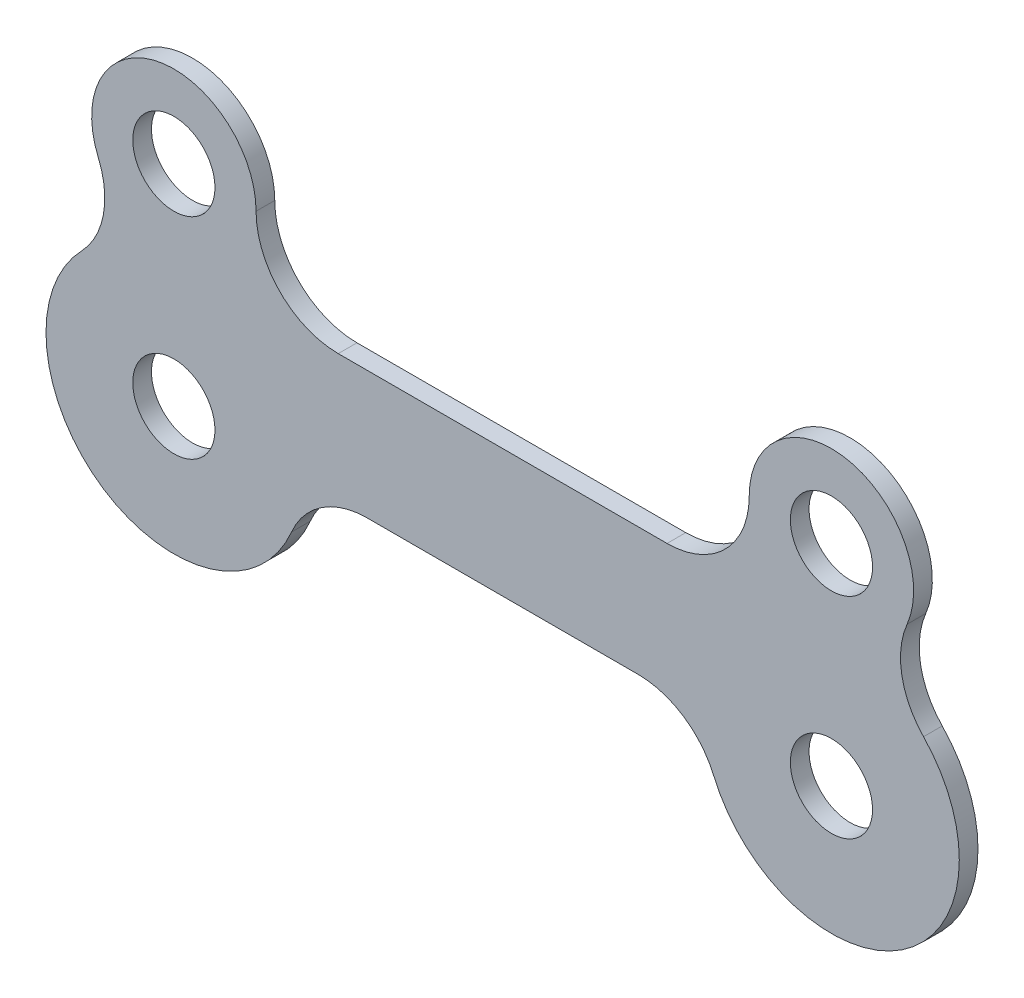
ISO-10303-21;
HEADER;
FILE_DESCRIPTION(('STEP AP214'),'2;1');
FILE_NAME('part.step','',(''),(''),'','','');
FILE_SCHEMA(('AUTOMOTIVE_DESIGN { 1 0 10303 214 1 1 1 1 }'));
ENDSEC;
DATA;
#1=APPLICATION_CONTEXT('core data for automotive mechanical design processes');
#2=APPLICATION_PROTOCOL_DEFINITION('international standard','automotive_design',2000,#1);
#3=PRODUCT_CONTEXT('',#1,'mechanical');
#4=PRODUCT('Part','Part','',(#3));
#5=PRODUCT_RELATED_PRODUCT_CATEGORY('part','',(#4));
#6=PRODUCT_DEFINITION_FORMATION('','',#4);
#7=PRODUCT_DEFINITION_CONTEXT('part definition',#1,'design');
#8=PRODUCT_DEFINITION('design','',#6,#7);
#9=PRODUCT_DEFINITION_SHAPE('','',#8);
#10=(LENGTH_UNIT() NAMED_UNIT(*) SI_UNIT(.MILLI.,.METRE.));
#11=(NAMED_UNIT(*) PLANE_ANGLE_UNIT() SI_UNIT($,.RADIAN.));
#12=(NAMED_UNIT(*) SI_UNIT($,.STERADIAN.) SOLID_ANGLE_UNIT());
#13=UNCERTAINTY_MEASURE_WITH_UNIT(LENGTH_MEASURE(1.E-05),#10,'distance_accuracy_value','');
#14=(GEOMETRIC_REPRESENTATION_CONTEXT(3) GLOBAL_UNCERTAINTY_ASSIGNED_CONTEXT((#13)) GLOBAL_UNIT_ASSIGNED_CONTEXT((#10,
#11,#12)) REPRESENTATION_CONTEXT('',''));
#15=CARTESIAN_POINT('',(0.,0.,0.));
#16=DIRECTION('',(0.,0.,1.));
#17=DIRECTION('',(1.,0.,0.));
#18=AXIS2_PLACEMENT_3D('',#15,#16,#17);
#19=CARTESIAN_POINT('',(35.149116844667,6.33274456521739,0.8128));
#20=DIRECTION('',(0.,0.,-1.));
#21=DIRECTION('',(-1.,0.,0.));
#22=AXIS2_PLACEMENT_3D('',#19,#20,#21);
#23=CYLINDRICAL_SURFACE('',#22,3.571875);
#24=CARTESIAN_POINT('',(35.149116844667,6.33274456521739,0.));
#25=DIRECTION('',(0.,0.,1.));
#26=DIRECTION('',(1.,0.,0.));
#27=AXIS2_PLACEMENT_3D('',#24,#25,#26);
#28=CIRCLE('',#27,3.571875);
#29=CARTESIAN_POINT('',(31.8620584223335,7.7304347826087,0.));
#30=VERTEX_POINT('',#29);
#31=CARTESIAN_POINT('',(32.5766363402321,3.8547140831758,0.));
#32=VERTEX_POINT('',#31);
#33=EDGE_CURVE('E180',#30,#32,#28,.T.);
#34=ORIENTED_EDGE('',*,*,#33,.F.);
#35=DIRECTION('',(0.,0.,-1.));
#36=VECTOR('',#35,1.);
#37=CARTESIAN_POINT('',(31.8620584223335,7.7304347826087,0.8128));
#38=LINE('',#37,#36);
#39=CARTESIAN_POINT('',(31.8620584223335,7.7304347826087,0.8128));
#40=VERTEX_POINT('',#39);
#41=EDGE_CURVE('E11',#40,#30,#38,.T.);
#42=ORIENTED_EDGE('',*,*,#41,.F.);
#43=CARTESIAN_POINT('',(35.149116844667,6.33274456521739,0.8128));
#44=DIRECTION('',(0.,0.,1.));
#45=DIRECTION('',(1.,0.,0.));
#46=AXIS2_PLACEMENT_3D('',#43,#44,#45);
#47=CIRCLE('',#46,3.571875);
#48=CARTESIAN_POINT('',(32.5766363402321,3.8547140831758,0.8128));
#49=VERTEX_POINT('',#48);
#50=EDGE_CURVE('E240',#40,#49,#47,.T.);
#51=ORIENTED_EDGE('',*,*,#50,.T.);
#52=DIRECTION('',(0.,0.,-1.));
#53=VECTOR('',#52,1.);
#54=CARTESIAN_POINT('',(32.5766363402321,3.8547140831758,0.8128));
#55=LINE('',#54,#53);
#56=EDGE_CURVE('E104',#49,#32,#55,.T.);
#57=ORIENTED_EDGE('',*,*,#56,.T.);
#58=EDGE_LOOP('',(#34,#42,#51,#57));
#59=FACE_BOUND('',#58,.T.);
#60=ADVANCED_FACE('F41',(#59),#23,.F.);
#61=CARTESIAN_POINT('',(28.575,9.128125,0.8128));
#62=DIRECTION('',(0.,0.,-1.));
#63=DIRECTION('',(-1.,0.,0.));
#64=AXIS2_PLACEMENT_3D('',#61,#62,#63);
#65=CYLINDRICAL_SURFACE('',#64,3.57187499999999);
#66=CARTESIAN_POINT('',(28.575,9.128125,0.));
#67=DIRECTION('',(0.,0.,1.));
#68=DIRECTION('',(1.,0.,0.));
#69=AXIS2_PLACEMENT_3D('',#66,#67,#68);
#70=CIRCLE('',#69,3.57187499999999);
#71=CARTESIAN_POINT('',(25.003125,9.128125,0.));
#72=VERTEX_POINT('',#71);
#73=EDGE_CURVE('E184',#30,#72,#70,.T.);
#74=ORIENTED_EDGE('',*,*,#73,.T.);
#75=DIRECTION('',(0.,0.,-1.));
#76=VECTOR('',#75,1.);
#77=CARTESIAN_POINT('',(25.003125,9.128125,0.8128));
#78=LINE('',#77,#76);
#79=CARTESIAN_POINT('',(25.003125,9.128125,0.8128));
#80=VERTEX_POINT('',#79);
#81=EDGE_CURVE('E50',#80,#72,#78,.T.);
#82=ORIENTED_EDGE('',*,*,#81,.F.);
#83=CARTESIAN_POINT('',(28.575,9.128125,0.8128));
#84=DIRECTION('',(0.,0.,1.));
#85=DIRECTION('',(1.,0.,0.));
#86=AXIS2_PLACEMENT_3D('',#83,#84,#85);
#87=CIRCLE('',#86,3.57187499999999);
#88=EDGE_CURVE('E288',#40,#80,#87,.T.);
#89=ORIENTED_EDGE('',*,*,#88,.F.);
#90=ORIENTED_EDGE('',*,*,#41,.T.);
#91=EDGE_LOOP('',(#74,#82,#89,#90));
#92=FACE_BOUND('',#91,.T.);
#93=ADVANCED_FACE('F274',(#92),#65,.T.);
#94=CARTESIAN_POINT('',(21.43125,9.128125,0.8128));
#95=DIRECTION('',(0.,0.,-1.));
#96=DIRECTION('',(-1.,0.,0.));
#97=AXIS2_PLACEMENT_3D('',#94,#95,#96);
#98=CYLINDRICAL_SURFACE('',#97,3.571875);
#99=CARTESIAN_POINT('',(21.43125,9.128125,0.));
#100=DIRECTION('',(0.,0.,1.));
#101=DIRECTION('',(1.,0.,0.));
#102=AXIS2_PLACEMENT_3D('',#99,#100,#101);
#103=CIRCLE('',#102,3.571875);
#104=CARTESIAN_POINT('',(21.43125,5.55625,0.));
#105=VERTEX_POINT('',#104);
#106=EDGE_CURVE('E188',#105,#72,#103,.T.);
#107=ORIENTED_EDGE('',*,*,#106,.F.);
#108=DIRECTION('',(0.,0.,-1.));
#109=VECTOR('',#108,1.);
#110=CARTESIAN_POINT('',(21.43125,5.55625,0.8128));
#111=LINE('',#110,#109);
#112=CARTESIAN_POINT('',(21.43125,5.55625,0.8128));
#113=VERTEX_POINT('',#112);
#114=EDGE_CURVE('E262',#113,#105,#111,.T.);
#115=ORIENTED_EDGE('',*,*,#114,.F.);
#116=CARTESIAN_POINT('',(21.43125,9.128125,0.8128));
#117=DIRECTION('',(0.,0.,1.));
#118=DIRECTION('',(1.,0.,0.));
#119=AXIS2_PLACEMENT_3D('',#116,#117,#118);
#120=CIRCLE('',#119,3.571875);
#121=EDGE_CURVE('E271',#113,#80,#120,.T.);
#122=ORIENTED_EDGE('',*,*,#121,.T.);
#123=ORIENTED_EDGE('',*,*,#81,.T.);
#124=EDGE_LOOP('',(#107,#115,#122,#123));
#125=FACE_BOUND('',#124,.T.);
#126=ADVANCED_FACE('F269',(#125),#98,.F.);
#127=CARTESIAN_POINT('',(0.,5.55625,0.8128));
#128=DIRECTION('',(0.,1.,0.));
#129=DIRECTION('',(0.,0.,1.));
#130=AXIS2_PLACEMENT_3D('',#127,#128,#129);
#131=PLANE('',#130);
#132=DIRECTION('',(1.,0.,0.));
#133=VECTOR('',#132,1.);
#134=CARTESIAN_POINT('',(0.,5.55625,0.));
#135=LINE('',#134,#133);
#136=CARTESIAN_POINT('',(7.14375,5.55625,0.));
#137=VERTEX_POINT('',#136);
#138=EDGE_CURVE('E192',#137,#105,#135,.T.);
#139=ORIENTED_EDGE('',*,*,#138,.F.);
#140=DIRECTION('',(0.,0.,-1.));
#141=VECTOR('',#140,1.);
#142=CARTESIAN_POINT('',(7.14375,5.55625,0.8128));
#143=LINE('',#142,#141);
#144=CARTESIAN_POINT('',(7.14375,5.55625,0.8128));
#145=VERTEX_POINT('',#144);
#146=EDGE_CURVE('E259',#145,#137,#143,.T.);
#147=ORIENTED_EDGE('',*,*,#146,.F.);
#148=DIRECTION('',(1.,0.,0.));
#149=VECTOR('',#148,1.);
#150=CARTESIAN_POINT('',(0.,5.55625,0.8128));
#151=LINE('',#150,#149);
#152=EDGE_CURVE('E285',#145,#113,#151,.T.);
#153=ORIENTED_EDGE('',*,*,#152,.T.);
#154=ORIENTED_EDGE('',*,*,#114,.T.);
#155=EDGE_LOOP('',(#139,#147,#153,#154));
#156=FACE_BOUND('',#155,.T.);
#157=ADVANCED_FACE('F282',(#156),#131,.T.);
#158=CARTESIAN_POINT('',(7.14375,9.128125,0.8128));
#159=DIRECTION('',(0.,0.,-1.));
#160=DIRECTION('',(-1.,0.,0.));
#161=AXIS2_PLACEMENT_3D('',#158,#159,#160);
#162=CYLINDRICAL_SURFACE('',#161,3.571875);
#163=CARTESIAN_POINT('',(7.14375,9.128125,0.));
#164=DIRECTION('',(0.,0.,1.));
#165=DIRECTION('',(1.,0.,0.));
#166=AXIS2_PLACEMENT_3D('',#163,#164,#165);
#167=CIRCLE('',#166,3.571875);
#168=CARTESIAN_POINT('',(3.571875,9.128125,0.));
#169=VERTEX_POINT('',#168);
#170=EDGE_CURVE('E196',#169,#137,#167,.T.);
#171=ORIENTED_EDGE('',*,*,#170,.F.);
#172=DIRECTION('',(0.,0.,-1.));
#173=VECTOR('',#172,1.);
#174=CARTESIAN_POINT('',(3.571875,9.128125,0.8128));
#175=LINE('',#174,#173);
#176=CARTESIAN_POINT('',(3.571875,9.128125,0.8128));
#177=VERTEX_POINT('',#176);
#178=EDGE_CURVE('E256',#177,#169,#175,.T.);
#179=ORIENTED_EDGE('',*,*,#178,.F.);
#180=CARTESIAN_POINT('',(7.14375,9.128125,0.8128));
#181=DIRECTION('',(0.,0.,1.));
#182=DIRECTION('',(1.,0.,0.));
#183=AXIS2_PLACEMENT_3D('',#180,#181,#182);
#184=CIRCLE('',#183,3.571875);
#185=EDGE_CURVE('E293',#177,#145,#184,.T.);
#186=ORIENTED_EDGE('',*,*,#185,.T.);
#187=ORIENTED_EDGE('',*,*,#146,.T.);
#188=EDGE_LOOP('',(#171,#179,#186,#187));
#189=FACE_BOUND('',#188,.T.);
#190=ADVANCED_FACE('F328',(#189),#162,.F.);
#191=CARTESIAN_POINT('',(0.,9.128125,0.8128));
#192=DIRECTION('',(0.,0.,-1.));
#193=DIRECTION('',(-1.,0.,0.));
#194=AXIS2_PLACEMENT_3D('',#191,#192,#193);
#195=CYLINDRICAL_SURFACE('',#194,3.571875);
#196=CARTESIAN_POINT('',(0.,9.128125,0.));
#197=DIRECTION('',(0.,0.,1.));
#198=DIRECTION('',(1.,0.,0.));
#199=AXIS2_PLACEMENT_3D('',#196,#197,#198);
#200=CIRCLE('',#199,3.571875);
#201=CARTESIAN_POINT('',(-3.28705842233351,7.73043478260869,0.));
#202=VERTEX_POINT('',#201);
#203=EDGE_CURVE('E200',#169,#202,#200,.T.);
#204=ORIENTED_EDGE('',*,*,#203,.T.);
#205=DIRECTION('',(0.,0.,-1.));
#206=VECTOR('',#205,1.);
#207=CARTESIAN_POINT('',(-3.28705842233351,7.73043478260869,0.8128));
#208=LINE('',#207,#206);
#209=CARTESIAN_POINT('',(-3.28705842233351,7.73043478260869,0.8128));
#210=VERTEX_POINT('',#209);
#211=EDGE_CURVE('E253',#210,#202,#208,.T.);
#212=ORIENTED_EDGE('',*,*,#211,.F.);
#213=CARTESIAN_POINT('',(0.,9.128125,0.8128));
#214=DIRECTION('',(0.,0.,1.));
#215=DIRECTION('',(1.,0.,0.));
#216=AXIS2_PLACEMENT_3D('',#213,#214,#215);
#217=CIRCLE('',#216,3.571875);
#218=EDGE_CURVE('E300',#177,#210,#217,.T.);
#219=ORIENTED_EDGE('',*,*,#218,.F.);
#220=ORIENTED_EDGE('',*,*,#178,.T.);
#221=EDGE_LOOP('',(#204,#212,#219,#220));
#222=FACE_BOUND('',#221,.T.);
#223=ADVANCED_FACE('F331',(#222),#195,.T.);
#224=CARTESIAN_POINT('',(-6.57411684466701,6.33274456521739,0.8128));
#225=DIRECTION('',(0.,0.,-1.));
#226=DIRECTION('',(-1.,0.,0.));
#227=AXIS2_PLACEMENT_3D('',#224,#225,#226);
#228=CYLINDRICAL_SURFACE('',#227,3.571875);
#229=CARTESIAN_POINT('',(-6.57411684466701,6.33274456521739,0.));
#230=DIRECTION('',(0.,0.,1.));
#231=DIRECTION('',(1.,0.,0.));
#232=AXIS2_PLACEMENT_3D('',#229,#230,#231);
#233=CIRCLE('',#232,3.571875);
#234=CARTESIAN_POINT('',(-4.0016363402321,3.8547140831758,0.));
#235=VERTEX_POINT('',#234);
#236=EDGE_CURVE('E204',#235,#202,#233,.T.);
#237=ORIENTED_EDGE('',*,*,#236,.F.);
#238=DIRECTION('',(0.,0.,-1.));
#239=VECTOR('',#238,1.);
#240=CARTESIAN_POINT('',(-4.0016363402321,3.8547140831758,0.8128));
#241=LINE('',#240,#239);
#242=CARTESIAN_POINT('',(-4.0016363402321,3.8547140831758,0.8128));
#243=VERTEX_POINT('',#242);
#244=EDGE_CURVE('E250',#243,#235,#241,.T.);
#245=ORIENTED_EDGE('',*,*,#244,.F.);
#246=CARTESIAN_POINT('',(-6.57411684466701,6.33274456521739,0.8128));
#247=DIRECTION('',(0.,0.,1.));
#248=DIRECTION('',(1.,0.,0.));
#249=AXIS2_PLACEMENT_3D('',#246,#247,#248);
#250=CIRCLE('',#249,3.571875);
#251=EDGE_CURVE('E303',#243,#210,#250,.T.);
#252=ORIENTED_EDGE('',*,*,#251,.T.);
#253=ORIENTED_EDGE('',*,*,#211,.T.);
#254=EDGE_LOOP('',(#237,#245,#252,#253));
#255=FACE_BOUND('',#254,.T.);
#256=ADVANCED_FACE('F335',(#255),#228,.F.);
#257=CARTESIAN_POINT('',(0.,0.,0.8128));
#258=DIRECTION('',(0.,0.,-1.));
#259=DIRECTION('',(-1.,0.,0.));
#260=AXIS2_PLACEMENT_3D('',#257,#258,#259);
#261=CYLINDRICAL_SURFACE('',#260,5.55625);
#262=CARTESIAN_POINT('',(0.,0.,0.));
#263=DIRECTION('',(0.,0.,1.));
#264=DIRECTION('',(1.,0.,0.));
#265=AXIS2_PLACEMENT_3D('',#262,#263,#264);
#266=CIRCLE('',#265,5.55625);
#267=CARTESIAN_POINT('',(5.11320199029657,-2.1741847826087,0.));
#268=VERTEX_POINT('',#267);
#269=EDGE_CURVE('E208',#235,#268,#266,.T.);
#270=ORIENTED_EDGE('',*,*,#269,.T.);
#271=DIRECTION('',(0.,0.,-1.));
#272=VECTOR('',#271,1.);
#273=CARTESIAN_POINT('',(5.11320199029657,-2.1741847826087,0.8128));
#274=LINE('',#273,#272);
#275=CARTESIAN_POINT('',(5.11320199029657,-2.1741847826087,0.8128));
#276=VERTEX_POINT('',#275);
#277=EDGE_CURVE('E247',#276,#268,#274,.T.);
#278=ORIENTED_EDGE('',*,*,#277,.F.);
#279=CARTESIAN_POINT('',(0.,0.,0.8128));
#280=DIRECTION('',(0.,0.,1.));
#281=DIRECTION('',(1.,0.,0.));
#282=AXIS2_PLACEMENT_3D('',#279,#280,#281);
#283=CIRCLE('',#282,5.55625);
#284=EDGE_CURVE('E307',#243,#276,#283,.T.);
#285=ORIENTED_EDGE('',*,*,#284,.F.);
#286=ORIENTED_EDGE('',*,*,#244,.T.);
#287=EDGE_LOOP('',(#270,#278,#285,#286));
#288=FACE_BOUND('',#287,.T.);
#289=ADVANCED_FACE('F339',(#288),#261,.T.);
#290=CARTESIAN_POINT('',(8.40026041263008,-3.571875,0.8128));
#291=DIRECTION('',(0.,0.,-1.));
#292=DIRECTION('',(-1.,0.,0.));
#293=AXIS2_PLACEMENT_3D('',#290,#291,#292);
#294=CYLINDRICAL_SURFACE('',#293,3.571875);
#295=CARTESIAN_POINT('',(8.40026041263008,-3.571875,0.));
#296=DIRECTION('',(0.,0.,1.));
#297=DIRECTION('',(1.,0.,0.));
#298=AXIS2_PLACEMENT_3D('',#295,#296,#297);
#299=CIRCLE('',#298,3.571875);
#300=CARTESIAN_POINT('',(8.40026041263008,0.,0.));
#301=VERTEX_POINT('',#300);
#302=EDGE_CURVE('E212',#301,#268,#299,.T.);
#303=ORIENTED_EDGE('',*,*,#302,.F.);
#304=DIRECTION('',(0.,0.,-1.));
#305=VECTOR('',#304,1.);
#306=CARTESIAN_POINT('',(8.40026041263008,0.,0.8128));
#307=LINE('',#306,#305);
#308=CARTESIAN_POINT('',(8.40026041263008,0.,0.8128));
#309=VERTEX_POINT('',#308);
#310=EDGE_CURVE('E155',#309,#301,#307,.T.);
#311=ORIENTED_EDGE('',*,*,#310,.F.);
#312=CARTESIAN_POINT('',(8.40026041263008,-3.571875,0.8128));
#313=DIRECTION('',(0.,0.,1.));
#314=DIRECTION('',(1.,0.,0.));
#315=AXIS2_PLACEMENT_3D('',#312,#313,#314);
#316=CIRCLE('',#315,3.571875);
#317=EDGE_CURVE('E142',#309,#276,#316,.T.);
#318=ORIENTED_EDGE('',*,*,#317,.T.);
#319=ORIENTED_EDGE('',*,*,#277,.T.);
#320=EDGE_LOOP('',(#303,#311,#318,#319));
#321=FACE_BOUND('',#320,.T.);
#322=ADVANCED_FACE('F312',(#321),#294,.F.);
#323=CARTESIAN_POINT('',(0.,0.,0.8128));
#324=DIRECTION('',(0.,1.,0.));
#325=DIRECTION('',(0.,0.,1.));
#326=AXIS2_PLACEMENT_3D('',#323,#324,#325);
#327=PLANE('',#326);
#328=DIRECTION('',(1.,0.,0.));
#329=VECTOR('',#328,1.);
#330=CARTESIAN_POINT('',(0.,0.,0.));
#331=LINE('',#330,#329);
#332=CARTESIAN_POINT('',(20.1747395873699,0.,0.));
#333=VERTEX_POINT('',#332);
#334=EDGE_CURVE('E150',#301,#333,#331,.T.);
#335=ORIENTED_EDGE('',*,*,#334,.T.);
#336=DIRECTION('',(0.,0.,-1.));
#337=VECTOR('',#336,1.);
#338=CARTESIAN_POINT('',(20.1747395873699,0.,0.8128));
#339=LINE('',#338,#337);
#340=CARTESIAN_POINT('',(20.1747395873699,0.,0.8128));
#341=VERTEX_POINT('',#340);
#342=EDGE_CURVE('E147',#341,#333,#339,.T.);
#343=ORIENTED_EDGE('',*,*,#342,.F.);
#344=DIRECTION('',(1.,0.,0.));
#345=VECTOR('',#344,1.);
#346=CARTESIAN_POINT('',(0.,0.,0.8128));
#347=LINE('',#346,#345);
#348=EDGE_CURVE('E135',#309,#341,#347,.T.);
#349=ORIENTED_EDGE('',*,*,#348,.F.);
#350=ORIENTED_EDGE('',*,*,#310,.T.);
#351=EDGE_LOOP('',(#335,#343,#349,#350));
#352=FACE_BOUND('',#351,.T.);
#353=ADVANCED_FACE('F148',(#352),#327,.F.);
#354=CARTESIAN_POINT('',(20.1747395873699,-3.571875,0.8128));
#355=DIRECTION('',(0.,0.,-1.));
#356=DIRECTION('',(-1.,0.,0.));
#357=AXIS2_PLACEMENT_3D('',#354,#355,#356);
#358=CYLINDRICAL_SURFACE('',#357,3.571875);
#359=CARTESIAN_POINT('',(20.1747395873699,-3.571875,0.));
#360=DIRECTION('',(0.,0.,1.));
#361=DIRECTION('',(1.,0.,0.));
#362=AXIS2_PLACEMENT_3D('',#359,#360,#361);
#363=CIRCLE('',#362,3.571875);
#364=CARTESIAN_POINT('',(23.4617980097034,-2.1741847826087,0.));
#365=VERTEX_POINT('',#364);
#366=EDGE_CURVE('E218',#365,#333,#363,.T.);
#367=ORIENTED_EDGE('',*,*,#366,.F.);
#368=DIRECTION('',(0.,0.,-1.));
#369=VECTOR('',#368,1.);
#370=CARTESIAN_POINT('',(23.4617980097034,-2.1741847826087,0.8128));
#371=LINE('',#370,#369);
#372=CARTESIAN_POINT('',(23.4617980097034,-2.1741847826087,0.8128));
#373=VERTEX_POINT('',#372);
#374=EDGE_CURVE('E97',#373,#365,#371,.T.);
#375=ORIENTED_EDGE('',*,*,#374,.F.);
#376=CARTESIAN_POINT('',(20.1747395873699,-3.571875,0.8128));
#377=DIRECTION('',(0.,0.,1.));
#378=DIRECTION('',(1.,0.,0.));
#379=AXIS2_PLACEMENT_3D('',#376,#377,#378);
#380=CIRCLE('',#379,3.571875);
#381=EDGE_CURVE('E140',#373,#341,#380,.T.);
#382=ORIENTED_EDGE('',*,*,#381,.T.);
#383=ORIENTED_EDGE('',*,*,#342,.T.);
#384=EDGE_LOOP('',(#367,#375,#382,#383));
#385=FACE_BOUND('',#384,.T.);
#386=ADVANCED_FACE('F157',(#385),#358,.F.);
#387=CARTESIAN_POINT('',(0.,9.128125,0.8128));
#388=DIRECTION('',(0.,0.,-1.));
#389=DIRECTION('',(-1.,0.,0.));
#390=AXIS2_PLACEMENT_3D('',#387,#388,#389);
#391=CYLINDRICAL_SURFACE('',#390,1.7859375);
#392=CARTESIAN_POINT('',(0.,9.128125,0.8128));
#393=DIRECTION('',(0.,0.,1.));
#394=DIRECTION('',(1.,0.,0.));
#395=AXIS2_PLACEMENT_3D('',#392,#393,#394);
#396=CIRCLE('',#395,1.7859375);
#397=CARTESIAN_POINT('',(1.7859375,9.128125,0.8128));
#398=VERTEX_POINT('',#397);
#399=EDGE_CURVE('E172',#398,#398,#396,.T.);
#400=ORIENTED_EDGE('',*,*,#399,.T.);
#401=EDGE_LOOP('',(#400));
#402=FACE_BOUND('',#401,.T.);
#403=CARTESIAN_POINT('',(0.,9.128125,0.));
#404=DIRECTION('',(0.,0.,1.));
#405=DIRECTION('',(1.,0.,0.));
#406=AXIS2_PLACEMENT_3D('',#403,#404,#405);
#407=CIRCLE('',#406,1.7859375);
#408=CARTESIAN_POINT('',(1.7859375,9.128125,0.));
#409=VERTEX_POINT('',#408);
#410=EDGE_CURVE('E232',#409,#409,#407,.T.);
#411=ORIENTED_EDGE('',*,*,#410,.F.);
#412=EDGE_LOOP('',(#411));
#413=FACE_BOUND('',#412,.T.);
#414=ADVANCED_FACE('F350',(#402,#413),#391,.F.);
#415=CARTESIAN_POINT('',(28.575,0.,0.8128));
#416=DIRECTION('',(0.,0.,-1.));
#417=DIRECTION('',(-1.,0.,0.));
#418=AXIS2_PLACEMENT_3D('',#415,#416,#417);
#419=CYLINDRICAL_SURFACE('',#418,1.7859375);
#420=CARTESIAN_POINT('',(28.575,0.,0.8128));
#421=DIRECTION('',(0.,0.,1.));
#422=DIRECTION('',(1.,0.,0.));
#423=AXIS2_PLACEMENT_3D('',#420,#421,#422);
#424=CIRCLE('',#423,1.7859375);
#425=CARTESIAN_POINT('',(30.3609375,0.,0.8128));
#426=VERTEX_POINT('',#425);
#427=EDGE_CURVE('E168',#426,#426,#424,.T.);
#428=ORIENTED_EDGE('',*,*,#427,.T.);
#429=EDGE_LOOP('',(#428));
#430=FACE_BOUND('',#429,.T.);
#431=CARTESIAN_POINT('',(28.575,0.,0.));
#432=DIRECTION('',(0.,0.,1.));
#433=DIRECTION('',(1.,0.,0.));
#434=AXIS2_PLACEMENT_3D('',#431,#432,#433);
#435=CIRCLE('',#434,1.7859375);
#436=CARTESIAN_POINT('',(30.3609375,0.,0.));
#437=VERTEX_POINT('',#436);
#438=EDGE_CURVE('E228',#437,#437,#435,.T.);
#439=ORIENTED_EDGE('',*,*,#438,.F.);
#440=EDGE_LOOP('',(#439));
#441=FACE_BOUND('',#440,.T.);
#442=ADVANCED_FACE('F357',(#430,#441),#419,.F.);
#443=CARTESIAN_POINT('',(0.,0.,0.8128));
#444=DIRECTION('',(0.,0.,-1.));
#445=DIRECTION('',(-1.,0.,0.));
#446=AXIS2_PLACEMENT_3D('',#443,#444,#445);
#447=CYLINDRICAL_SURFACE('',#446,1.7859375);
#448=CARTESIAN_POINT('',(0.,0.,0.8128));
#449=DIRECTION('',(0.,0.,1.));
#450=DIRECTION('',(1.,0.,0.));
#451=AXIS2_PLACEMENT_3D('',#448,#449,#450);
#452=CIRCLE('',#451,1.7859375);
#453=CARTESIAN_POINT('',(1.7859375,0.,0.8128));
#454=VERTEX_POINT('',#453);
#455=EDGE_CURVE('E161',#454,#454,#452,.T.);
#456=ORIENTED_EDGE('',*,*,#455,.T.);
#457=EDGE_LOOP('',(#456));
#458=FACE_BOUND('',#457,.T.);
#459=CARTESIAN_POINT('',(0.,0.,0.));
#460=DIRECTION('',(0.,0.,1.));
#461=DIRECTION('',(1.,0.,0.));
#462=AXIS2_PLACEMENT_3D('',#459,#460,#461);
#463=CIRCLE('',#462,1.7859375);
#464=CARTESIAN_POINT('',(1.7859375,0.,0.));
#465=VERTEX_POINT('',#464);
#466=EDGE_CURVE('E224',#465,#465,#463,.T.);
#467=ORIENTED_EDGE('',*,*,#466,.F.);
#468=EDGE_LOOP('',(#467));
#469=FACE_BOUND('',#468,.T.);
#470=ADVANCED_FACE('F354',(#458,#469),#447,.F.);
#471=CARTESIAN_POINT('',(28.575,0.,0.8128));
#472=DIRECTION('',(0.,0.,-1.));
#473=DIRECTION('',(-1.,0.,0.));
#474=AXIS2_PLACEMENT_3D('',#471,#472,#473);
#475=CYLINDRICAL_SURFACE('',#474,5.55625);
#476=CARTESIAN_POINT('',(28.575,0.,0.));
#477=DIRECTION('',(0.,0.,1.));
#478=DIRECTION('',(1.,0.,0.));
#479=AXIS2_PLACEMENT_3D('',#476,#477,#478);
#480=CIRCLE('',#479,5.55625);
#481=EDGE_CURVE('E221',#365,#32,#480,.T.);
#482=ORIENTED_EDGE('',*,*,#481,.T.);
#483=ORIENTED_EDGE('',*,*,#56,.F.);
#484=CARTESIAN_POINT('',(28.575,0.,0.8128));
#485=DIRECTION('',(0.,0.,1.));
#486=DIRECTION('',(1.,0.,0.));
#487=AXIS2_PLACEMENT_3D('',#484,#485,#486);
#488=CIRCLE('',#487,5.55625);
#489=EDGE_CURVE('E58',#373,#49,#488,.T.);
#490=ORIENTED_EDGE('',*,*,#489,.F.);
#491=ORIENTED_EDGE('',*,*,#374,.T.);
#492=EDGE_LOOP('',(#482,#483,#490,#491));
#493=FACE_BOUND('',#492,.T.);
#494=ADVANCED_FACE('F315',(#493),#475,.T.);
#495=CARTESIAN_POINT('',(28.575,9.128125,0.8128));
#496=DIRECTION('',(0.,0.,-1.));
#497=DIRECTION('',(-1.,0.,0.));
#498=AXIS2_PLACEMENT_3D('',#495,#496,#497);
#499=CYLINDRICAL_SURFACE('',#498,1.7859375);
#500=CARTESIAN_POINT('',(28.575,9.128125,0.8128));
#501=DIRECTION('',(0.,0.,1.));
#502=DIRECTION('',(1.,0.,0.));
#503=AXIS2_PLACEMENT_3D('',#500,#501,#502);
#504=CIRCLE('',#503,1.7859375);
#505=CARTESIAN_POINT('',(30.3609375,9.128125,0.8128));
#506=VERTEX_POINT('',#505);
#507=EDGE_CURVE('E176',#506,#506,#504,.T.);
#508=ORIENTED_EDGE('',*,*,#507,.T.);
#509=EDGE_LOOP('',(#508));
#510=FACE_BOUND('',#509,.T.);
#511=CARTESIAN_POINT('',(28.575,9.128125,0.));
#512=DIRECTION('',(0.,0.,1.));
#513=DIRECTION('',(1.,0.,0.));
#514=AXIS2_PLACEMENT_3D('',#511,#512,#513);
#515=CIRCLE('',#514,1.7859375);
#516=CARTESIAN_POINT('',(30.3609375,9.128125,0.));
#517=VERTEX_POINT('',#516);
#518=EDGE_CURVE('E236',#517,#517,#515,.T.);
#519=ORIENTED_EDGE('',*,*,#518,.F.);
#520=EDGE_LOOP('',(#519));
#521=FACE_BOUND('',#520,.T.);
#522=ADVANCED_FACE('F353',(#510,#521),#499,.F.);
#523=CARTESIAN_POINT('',(0.,0.,0.8128));
#524=DIRECTION('',(0.,0.,1.));
#525=DIRECTION('',(1.,0.,0.));
#526=AXIS2_PLACEMENT_3D('',#523,#524,#525);
#527=PLANE('',#526);
#528=ORIENTED_EDGE('',*,*,#50,.F.);
#529=ORIENTED_EDGE('',*,*,#88,.T.);
#530=ORIENTED_EDGE('',*,*,#121,.F.);
#531=ORIENTED_EDGE('',*,*,#152,.F.);
#532=ORIENTED_EDGE('',*,*,#185,.F.);
#533=ORIENTED_EDGE('',*,*,#218,.T.);
#534=ORIENTED_EDGE('',*,*,#251,.F.);
#535=ORIENTED_EDGE('',*,*,#284,.T.);
#536=ORIENTED_EDGE('',*,*,#317,.F.);
#537=ORIENTED_EDGE('',*,*,#348,.T.);
#538=ORIENTED_EDGE('',*,*,#381,.F.);
#539=ORIENTED_EDGE('',*,*,#489,.T.);
#540=EDGE_LOOP('',(#528,#529,#530,#531,#532,#533,#534,#535,#536,#537,#538,#539));
#541=FACE_BOUND('',#540,.T.);
#542=ORIENTED_EDGE('',*,*,#455,.F.);
#543=EDGE_LOOP('',(#542));
#544=FACE_BOUND('',#543,.T.);
#545=ORIENTED_EDGE('',*,*,#427,.F.);
#546=EDGE_LOOP('',(#545));
#547=FACE_BOUND('',#546,.T.);
#548=ORIENTED_EDGE('',*,*,#399,.F.);
#549=EDGE_LOOP('',(#548));
#550=FACE_BOUND('',#549,.T.);
#551=ORIENTED_EDGE('',*,*,#507,.F.);
#552=EDGE_LOOP('',(#551));
#553=FACE_BOUND('',#552,.T.);
#554=ADVANCED_FACE('F137',(#541,#544,#547,#550,#553),#527,.T.);
#555=CARTESIAN_POINT('',(0.,0.,0.));
#556=DIRECTION('',(0.,0.,1.));
#557=DIRECTION('',(1.,0.,0.));
#558=AXIS2_PLACEMENT_3D('',#555,#556,#557);
#559=PLANE('',#558);
#560=ORIENTED_EDGE('',*,*,#33,.T.);
#561=ORIENTED_EDGE('',*,*,#481,.F.);
#562=ORIENTED_EDGE('',*,*,#366,.T.);
#563=ORIENTED_EDGE('',*,*,#334,.F.);
#564=ORIENTED_EDGE('',*,*,#302,.T.);
#565=ORIENTED_EDGE('',*,*,#269,.F.);
#566=ORIENTED_EDGE('',*,*,#236,.T.);
#567=ORIENTED_EDGE('',*,*,#203,.F.);
#568=ORIENTED_EDGE('',*,*,#170,.T.);
#569=ORIENTED_EDGE('',*,*,#138,.T.);
#570=ORIENTED_EDGE('',*,*,#106,.T.);
#571=ORIENTED_EDGE('',*,*,#73,.F.);
#572=EDGE_LOOP('',(#560,#561,#562,#563,#564,#565,#566,#567,#568,#569,#570,#571));
#573=FACE_BOUND('',#572,.T.);
#574=ORIENTED_EDGE('',*,*,#466,.T.);
#575=EDGE_LOOP('',(#574));
#576=FACE_BOUND('',#575,.T.);
#577=ORIENTED_EDGE('',*,*,#438,.T.);
#578=EDGE_LOOP('',(#577));
#579=FACE_BOUND('',#578,.T.);
#580=ORIENTED_EDGE('',*,*,#410,.T.);
#581=EDGE_LOOP('',(#580));
#582=FACE_BOUND('',#581,.T.);
#583=ORIENTED_EDGE('',*,*,#518,.T.);
#584=EDGE_LOOP('',(#583));
#585=FACE_BOUND('',#584,.T.);
#586=ADVANCED_FACE('F276',(#573,#576,#579,#582,#585),#559,.F.);
#587=CLOSED_SHELL('',(#60,#93,#126,#157,#190,#223,#256,#289,#322,#353,#386,#414,#442,#470,#494,
#522,#554,#586));
#588=MANIFOLD_SOLID_BREP('B2',#587);
#589=ADVANCED_BREP_SHAPE_REPRESENTATION('',(#18,#588),#14);
#590=SHAPE_DEFINITION_REPRESENTATION(#9,#589);
ENDSEC;
END-ISO-10303-21;
